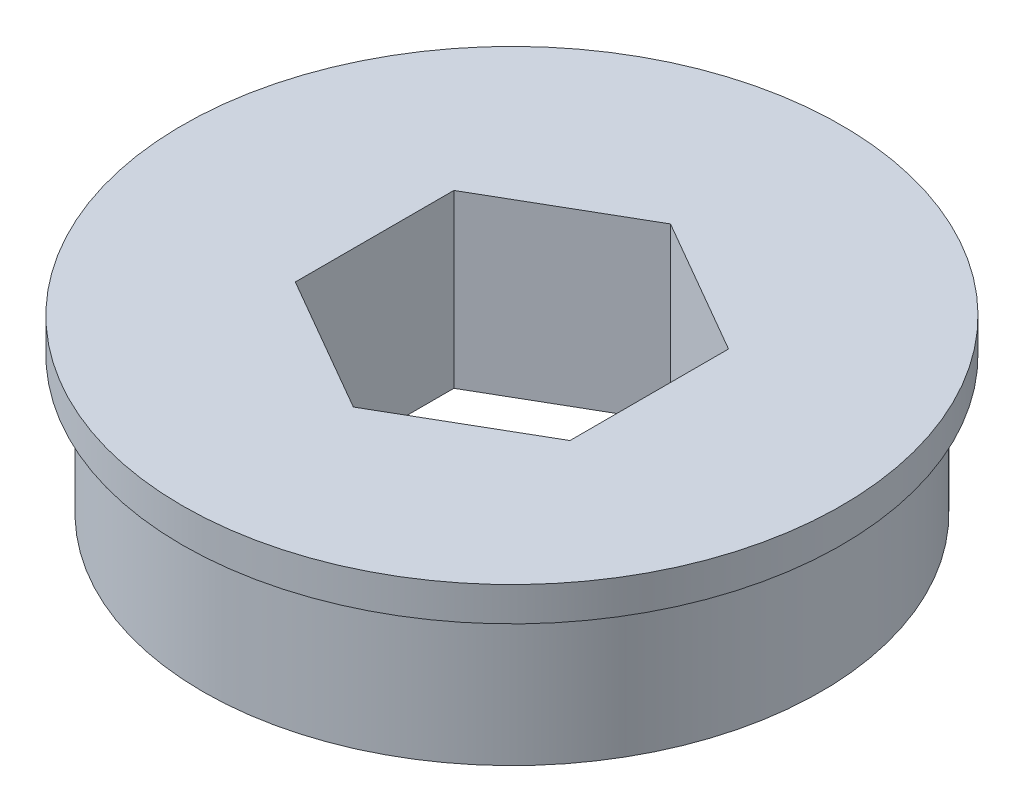
ISO-10303-21;
HEADER;
FILE_DESCRIPTION(('STEP AP214'),'2;1');
FILE_NAME('part.step','',(''),(''),'','','');
FILE_SCHEMA(('AUTOMOTIVE_DESIGN { 1 0 10303 214 1 1 1 1 }'));
ENDSEC;
DATA;
#1=APPLICATION_CONTEXT('core data for automotive mechanical design processes');
#2=APPLICATION_PROTOCOL_DEFINITION('international standard','automotive_design',2000,#1);
#3=PRODUCT_CONTEXT('',#1,'mechanical');
#4=PRODUCT('Part','Part','',(#3));
#5=PRODUCT_RELATED_PRODUCT_CATEGORY('part','',(#4));
#6=PRODUCT_DEFINITION_FORMATION('','',#4);
#7=PRODUCT_DEFINITION_CONTEXT('part definition',#1,'design');
#8=PRODUCT_DEFINITION('design','',#6,#7);
#9=PRODUCT_DEFINITION_SHAPE('','',#8);
#10=(LENGTH_UNIT() NAMED_UNIT(*) SI_UNIT(.MILLI.,.METRE.));
#11=(NAMED_UNIT(*) PLANE_ANGLE_UNIT() SI_UNIT($,.RADIAN.));
#12=(NAMED_UNIT(*) SI_UNIT($,.STERADIAN.) SOLID_ANGLE_UNIT());
#13=UNCERTAINTY_MEASURE_WITH_UNIT(LENGTH_MEASURE(1.E-05),#10,'distance_accuracy_value','');
#14=(GEOMETRIC_REPRESENTATION_CONTEXT(3) GLOBAL_UNCERTAINTY_ASSIGNED_CONTEXT((#13)) GLOBAL_UNIT_ASSIGNED_CONTEXT((#10,
#11,#12)) REPRESENTATION_CONTEXT('',''));
#15=CARTESIAN_POINT('',(0.,0.,0.));
#16=DIRECTION('',(0.,0.,1.));
#17=DIRECTION('',(1.,0.,0.));
#18=AXIS2_PLACEMENT_3D('',#15,#16,#17);
#19=CARTESIAN_POINT('',(0.,0.,0.));
#20=DIRECTION('',(0.,1.,0.));
#21=DIRECTION('',(0.,0.,1.));
#22=AXIS2_PLACEMENT_3D('',#19,#20,#21);
#23=PLANE('',#22);
#24=CARTESIAN_POINT('',(0.,0.,0.));
#25=DIRECTION('',(0.,1.,0.));
#26=DIRECTION('',(0.,0.,1.));
#27=AXIS2_PLACEMENT_3D('',#24,#25,#26);
#28=CIRCLE('',#27,14.2875);
#29=CARTESIAN_POINT('',(0.,0.,14.2875));
#30=VERTEX_POINT('',#29);
#31=EDGE_CURVE('E36',#30,#30,#28,.T.);
#32=ORIENTED_EDGE('',*,*,#31,.F.);
#33=EDGE_LOOP('',(#32));
#34=FACE_BOUND('',#33,.T.);
#35=DIRECTION('',(0.866025403784438,0.,0.5));
#36=VECTOR('',#35,1.);
#37=CARTESIAN_POINT('',(-6.35000000000006,0.,3.66617420935416));
#38=LINE('',#37,#36);
#39=CARTESIAN_POINT('',(-6.35000000000006,0.,3.66617420935416));
#40=VERTEX_POINT('',#39);
#41=CARTESIAN_POINT('',(0.,0.,7.33234841870831));
#42=VERTEX_POINT('',#41);
#43=EDGE_CURVE('E47',#40,#42,#38,.T.);
#44=ORIENTED_EDGE('',*,*,#43,.T.);
#45=DIRECTION('',(0.866025403784439,0.,-0.5));
#46=VECTOR('',#45,1.);
#47=CARTESIAN_POINT('',(0.,0.,7.33234841870831));
#48=LINE('',#47,#46);
#49=CARTESIAN_POINT('',(6.35000000000006,0.,3.66617420935416));
#50=VERTEX_POINT('',#49);
#51=EDGE_CURVE('E126',#42,#50,#48,.T.);
#52=ORIENTED_EDGE('',*,*,#51,.T.);
#53=DIRECTION('',(0.,0.,-1.));
#54=VECTOR('',#53,1.);
#55=CARTESIAN_POINT('',(6.35000000000006,0.,3.66617420935416));
#56=LINE('',#55,#54);
#57=CARTESIAN_POINT('',(6.35000000000006,0.,-3.66617420935417));
#58=VERTEX_POINT('',#57);
#59=EDGE_CURVE('E129',#50,#58,#56,.T.);
#60=ORIENTED_EDGE('',*,*,#59,.T.);
#61=DIRECTION('',(-0.866025403784439,0.,-0.5));
#62=VECTOR('',#61,1.);
#63=CARTESIAN_POINT('',(6.35000000000006,0.,-3.66617420935417));
#64=LINE('',#63,#62);
#65=CARTESIAN_POINT('',(0.,0.,-7.33234841870832));
#66=VERTEX_POINT('',#65);
#67=EDGE_CURVE('E132',#58,#66,#64,.T.);
#68=ORIENTED_EDGE('',*,*,#67,.T.);
#69=DIRECTION('',(-0.866025403784438,0.,0.500000000000001));
#70=VECTOR('',#69,1.);
#71=CARTESIAN_POINT('',(0.,0.,-7.33234841870832));
#72=LINE('',#71,#70);
#73=CARTESIAN_POINT('',(-6.35000000000006,0.,-3.66617420935415));
#74=VERTEX_POINT('',#73);
#75=EDGE_CURVE('E91',#66,#74,#72,.T.);
#76=ORIENTED_EDGE('',*,*,#75,.T.);
#77=DIRECTION('',(0.,0.,1.));
#78=VECTOR('',#77,1.);
#79=CARTESIAN_POINT('',(-6.35000000000006,0.,-3.66617420935415));
#80=LINE('',#79,#78);
#81=EDGE_CURVE('E135',#74,#40,#80,.T.);
#82=ORIENTED_EDGE('',*,*,#81,.T.);
#83=EDGE_LOOP('',(#44,#52,#60,#68,#76,#82));
#84=FACE_BOUND('',#83,.T.);
#85=ADVANCED_FACE('F32',(#34,#84),#23,.F.);
#86=CARTESIAN_POINT('',(0.,6.35,0.));
#87=DIRECTION('',(0.,-1.,0.));
#88=DIRECTION('',(0.,0.,-1.));
#89=AXIS2_PLACEMENT_3D('',#86,#87,#88);
#90=CYLINDRICAL_SURFACE('',#89,14.2875);
#91=CARTESIAN_POINT('',(0.,6.35,0.));
#92=DIRECTION('',(0.,1.,0.));
#93=DIRECTION('',(0.,0.,1.));
#94=AXIS2_PLACEMENT_3D('',#91,#92,#93);
#95=CIRCLE('',#94,14.2875);
#96=CARTESIAN_POINT('',(0.,6.35,14.2875));
#97=VERTEX_POINT('',#96);
#98=EDGE_CURVE('E11',#97,#97,#95,.T.);
#99=ORIENTED_EDGE('',*,*,#98,.F.);
#100=EDGE_LOOP('',(#99));
#101=FACE_BOUND('',#100,.T.);
#102=ORIENTED_EDGE('',*,*,#31,.T.);
#103=EDGE_LOOP('',(#102));
#104=FACE_BOUND('',#103,.T.);
#105=ADVANCED_FACE('F34',(#101,#104),#90,.T.);
#106=CARTESIAN_POINT('',(-6.35000000000006,6.35,3.66617420935416));
#107=DIRECTION('',(0.5,0.,-0.866025403784438));
#108=DIRECTION('',(-0.866025403784439,0.,-0.5));
#109=AXIS2_PLACEMENT_3D('',#106,#107,#108);
#110=PLANE('',#109);
#111=ORIENTED_EDGE('',*,*,#43,.F.);
#112=DIRECTION('',(0.,-1.,0.));
#113=VECTOR('',#112,1.);
#114=CARTESIAN_POINT('',(-6.35000000000006,6.35,3.66617420935416));
#115=LINE('',#114,#113);
#116=CARTESIAN_POINT('',(-6.35000000000005,7.9248,3.66617420935418));
#117=VERTEX_POINT('',#116);
#118=EDGE_CURVE('E138',#117,#40,#115,.T.);
#119=ORIENTED_EDGE('',*,*,#118,.F.);
#120=DIRECTION('',(0.866025403784441,0.,0.499999999999996));
#121=VECTOR('',#120,1.);
#122=CARTESIAN_POINT('',(-6.35000000000005,7.9248,3.66617420935418));
#123=LINE('',#122,#121);
#124=CARTESIAN_POINT('',(0.,7.9248,7.33234841870832));
#125=VERTEX_POINT('',#124);
#126=EDGE_CURVE('E109',#117,#125,#123,.T.);
#127=ORIENTED_EDGE('',*,*,#126,.T.);
#128=DIRECTION('',(0.,-1.,0.));
#129=VECTOR('',#128,1.);
#130=CARTESIAN_POINT('',(0.,6.35,7.33234841870831));
#131=LINE('',#130,#129);
#132=EDGE_CURVE('E144',#125,#42,#131,.T.);
#133=ORIENTED_EDGE('',*,*,#132,.T.);
#134=EDGE_LOOP('',(#111,#119,#127,#133));
#135=FACE_BOUND('',#134,.T.);
#136=ADVANCED_FACE('F153',(#135),#110,.T.);
#137=CARTESIAN_POINT('',(0.,6.35,7.33234841870831));
#138=DIRECTION('',(-0.5,0.,-0.866025403784439));
#139=DIRECTION('',(-0.866025403784439,0.,0.5));
#140=AXIS2_PLACEMENT_3D('',#137,#138,#139);
#141=PLANE('',#140);
#142=ORIENTED_EDGE('',*,*,#51,.F.);
#143=ORIENTED_EDGE('',*,*,#132,.F.);
#144=DIRECTION('',(0.866025403784435,0.,-0.500000000000006));
#145=VECTOR('',#144,1.);
#146=CARTESIAN_POINT('',(0.,7.9248,7.33234841870832));
#147=LINE('',#146,#145);
#148=CARTESIAN_POINT('',(6.35000000000009,7.9248,3.66617420935411));
#149=VERTEX_POINT('',#148);
#150=EDGE_CURVE('E114',#125,#149,#147,.T.);
#151=ORIENTED_EDGE('',*,*,#150,.T.);
#152=DIRECTION('',(0.,-1.,0.));
#153=VECTOR('',#152,1.);
#154=CARTESIAN_POINT('',(6.35000000000006,6.35,3.66617420935416));
#155=LINE('',#154,#153);
#156=EDGE_CURVE('E142',#149,#50,#155,.T.);
#157=ORIENTED_EDGE('',*,*,#156,.T.);
#158=EDGE_LOOP('',(#142,#143,#151,#157));
#159=FACE_BOUND('',#158,.T.);
#160=ADVANCED_FACE('F156',(#159),#141,.T.);
#161=CARTESIAN_POINT('',(6.35000000000006,6.35,3.66617420935416));
#162=DIRECTION('',(-1.,0.,0.));
#163=DIRECTION('',(0.,0.,1.));
#164=AXIS2_PLACEMENT_3D('',#161,#162,#163);
#165=PLANE('',#164);
#166=ORIENTED_EDGE('',*,*,#59,.F.);
#167=ORIENTED_EDGE('',*,*,#156,.F.);
#168=DIRECTION('',(0.,0.,-1.));
#169=VECTOR('',#168,1.);
#170=CARTESIAN_POINT('',(6.35000000000009,7.9248,3.66617420935411));
#171=LINE('',#170,#169);
#172=CARTESIAN_POINT('',(6.35000000000002,7.9248,-3.66617420935423));
#173=VERTEX_POINT('',#172);
#174=EDGE_CURVE('E117',#149,#173,#171,.T.);
#175=ORIENTED_EDGE('',*,*,#174,.T.);
#176=DIRECTION('',(0.,-1.,0.));
#177=VECTOR('',#176,1.);
#178=CARTESIAN_POINT('',(6.35000000000006,6.35,-3.66617420935417));
#179=LINE('',#178,#177);
#180=EDGE_CURVE('E95',#173,#58,#179,.T.);
#181=ORIENTED_EDGE('',*,*,#180,.T.);
#182=EDGE_LOOP('',(#166,#167,#175,#181));
#183=FACE_BOUND('',#182,.T.);
#184=ADVANCED_FACE('F159',(#183),#165,.T.);
#185=CARTESIAN_POINT('',(6.35000000000006,6.35,-3.66617420935417));
#186=DIRECTION('',(-0.5,0.,0.866025403784439));
#187=DIRECTION('',(0.866025403784439,0.,0.5));
#188=AXIS2_PLACEMENT_3D('',#185,#186,#187);
#189=PLANE('',#188);
#190=ORIENTED_EDGE('',*,*,#67,.F.);
#191=ORIENTED_EDGE('',*,*,#180,.F.);
#192=DIRECTION('',(-0.866025403784441,0.,-0.499999999999996));
#193=VECTOR('',#192,1.);
#194=CARTESIAN_POINT('',(6.35000000000002,7.9248,-3.66617420935423));
#195=LINE('',#194,#193);
#196=CARTESIAN_POINT('',(0.,7.9248,-7.33234841870832));
#197=VERTEX_POINT('',#196);
#198=EDGE_CURVE('E98',#173,#197,#195,.T.);
#199=ORIENTED_EDGE('',*,*,#198,.T.);
#200=DIRECTION('',(0.,-1.,0.));
#201=VECTOR('',#200,1.);
#202=CARTESIAN_POINT('',(0.,6.35,-7.33234841870832));
#203=LINE('',#202,#201);
#204=EDGE_CURVE('E84',#197,#66,#203,.T.);
#205=ORIENTED_EDGE('',*,*,#204,.T.);
#206=EDGE_LOOP('',(#190,#191,#199,#205));
#207=FACE_BOUND('',#206,.T.);
#208=ADVANCED_FACE('F99',(#207),#189,.T.);
#209=CARTESIAN_POINT('',(0.,6.35,-7.33234841870832));
#210=DIRECTION('',(0.500000000000001,0.,0.866025403784438));
#211=DIRECTION('',(0.866025403784438,0.,-0.500000000000001));
#212=AXIS2_PLACEMENT_3D('',#209,#210,#211);
#213=PLANE('',#212);
#214=ORIENTED_EDGE('',*,*,#75,.F.);
#215=ORIENTED_EDGE('',*,*,#204,.F.);
#216=DIRECTION('',(-0.866025403784439,0.,0.5));
#217=VECTOR('',#216,1.);
#218=CARTESIAN_POINT('',(0.,7.9248,-7.33234841870832));
#219=LINE('',#218,#217);
#220=CARTESIAN_POINT('',(-6.35000000000007,7.9248,-3.66617420935415));
#221=VERTEX_POINT('',#220);
#222=EDGE_CURVE('E88',#197,#221,#219,.T.);
#223=ORIENTED_EDGE('',*,*,#222,.T.);
#224=DIRECTION('',(0.,-1.,0.));
#225=VECTOR('',#224,1.);
#226=CARTESIAN_POINT('',(-6.35000000000006,6.35,-3.66617420935415));
#227=LINE('',#226,#225);
#228=EDGE_CURVE('E55',#221,#74,#227,.T.);
#229=ORIENTED_EDGE('',*,*,#228,.T.);
#230=EDGE_LOOP('',(#214,#215,#223,#229));
#231=FACE_BOUND('',#230,.T.);
#232=ADVANCED_FACE('F86',(#231),#213,.T.);
#233=CARTESIAN_POINT('',(-6.35000000000006,6.35,-3.66617420935415));
#234=DIRECTION('',(1.,0.,0.));
#235=DIRECTION('',(0.,0.,-1.));
#236=AXIS2_PLACEMENT_3D('',#233,#234,#235);
#237=PLANE('',#236);
#238=ORIENTED_EDGE('',*,*,#81,.F.);
#239=ORIENTED_EDGE('',*,*,#228,.F.);
#240=DIRECTION('',(0.,0.,1.));
#241=VECTOR('',#240,1.);
#242=CARTESIAN_POINT('',(-6.35000000000007,7.9248,-3.66617420935415));
#243=LINE('',#242,#241);
#244=EDGE_CURVE('E107',#221,#117,#243,.T.);
#245=ORIENTED_EDGE('',*,*,#244,.T.);
#246=ORIENTED_EDGE('',*,*,#118,.T.);
#247=EDGE_LOOP('',(#238,#239,#245,#246));
#248=FACE_BOUND('',#247,.T.);
#249=ADVANCED_FACE('F152',(#248),#237,.T.);
#250=CARTESIAN_POINT('',(0.,6.35,0.));
#251=DIRECTION('',(0.,1.,0.));
#252=DIRECTION('',(0.,0.,1.));
#253=AXIS2_PLACEMENT_3D('',#250,#251,#252);
#254=PLANE('',#253);
#255=CARTESIAN_POINT('',(0.,6.35,0.));
#256=DIRECTION('',(0.,1.,0.));
#257=DIRECTION('',(0.,0.,1.));
#258=AXIS2_PLACEMENT_3D('',#255,#256,#257);
#259=CIRCLE('',#258,15.24);
#260=CARTESIAN_POINT('',(0.,6.35,15.24));
#261=VERTEX_POINT('',#260);
#262=EDGE_CURVE('E119',#261,#261,#259,.T.);
#263=ORIENTED_EDGE('',*,*,#262,.F.);
#264=EDGE_LOOP('',(#263));
#265=FACE_BOUND('',#264,.T.);
#266=ORIENTED_EDGE('',*,*,#98,.T.);
#267=EDGE_LOOP('',(#266));
#268=FACE_BOUND('',#267,.T.);
#269=ADVANCED_FACE('F179',(#265,#268),#254,.F.);
#270=CARTESIAN_POINT('',(0.,7.9248,0.));
#271=DIRECTION('',(0.,1.,0.));
#272=DIRECTION('',(0.,0.,1.));
#273=AXIS2_PLACEMENT_3D('',#270,#271,#272);
#274=PLANE('',#273);
#275=CARTESIAN_POINT('',(0.,7.9248,0.));
#276=DIRECTION('',(0.,1.,0.));
#277=DIRECTION('',(0.,0.,1.));
#278=AXIS2_PLACEMENT_3D('',#275,#276,#277);
#279=CIRCLE('',#278,15.24);
#280=CARTESIAN_POINT('',(0.,7.9248,15.24));
#281=VERTEX_POINT('',#280);
#282=EDGE_CURVE('E120',#281,#281,#279,.T.);
#283=ORIENTED_EDGE('',*,*,#282,.T.);
#284=EDGE_LOOP('',(#283));
#285=FACE_BOUND('',#284,.T.);
#286=ORIENTED_EDGE('',*,*,#222,.F.);
#287=ORIENTED_EDGE('',*,*,#198,.F.);
#288=ORIENTED_EDGE('',*,*,#174,.F.);
#289=ORIENTED_EDGE('',*,*,#150,.F.);
#290=ORIENTED_EDGE('',*,*,#126,.F.);
#291=ORIENTED_EDGE('',*,*,#244,.F.);
#292=EDGE_LOOP('',(#286,#287,#288,#289,#290,#291));
#293=FACE_BOUND('',#292,.T.);
#294=ADVANCED_FACE('F104',(#285,#293),#274,.T.);
#295=CARTESIAN_POINT('',(0.,7.9248,0.));
#296=DIRECTION('',(0.,-1.,0.));
#297=DIRECTION('',(0.,0.,-1.));
#298=AXIS2_PLACEMENT_3D('',#295,#296,#297);
#299=CYLINDRICAL_SURFACE('',#298,15.24);
#300=ORIENTED_EDGE('',*,*,#282,.F.);
#301=EDGE_LOOP('',(#300));
#302=FACE_BOUND('',#301,.T.);
#303=ORIENTED_EDGE('',*,*,#262,.T.);
#304=EDGE_LOOP('',(#303));
#305=FACE_BOUND('',#304,.T.);
#306=ADVANCED_FACE('F187',(#302,#305),#299,.T.);
#307=CLOSED_SHELL('',(#85,#105,#136,#160,#184,#208,#232,#249,#269,#294,#306));
#308=MANIFOLD_SOLID_BREP('B2',#307);
#309=ADVANCED_BREP_SHAPE_REPRESENTATION('',(#18,#308),#14);
#310=SHAPE_DEFINITION_REPRESENTATION(#9,#309);
ENDSEC;
END-ISO-10303-21;
